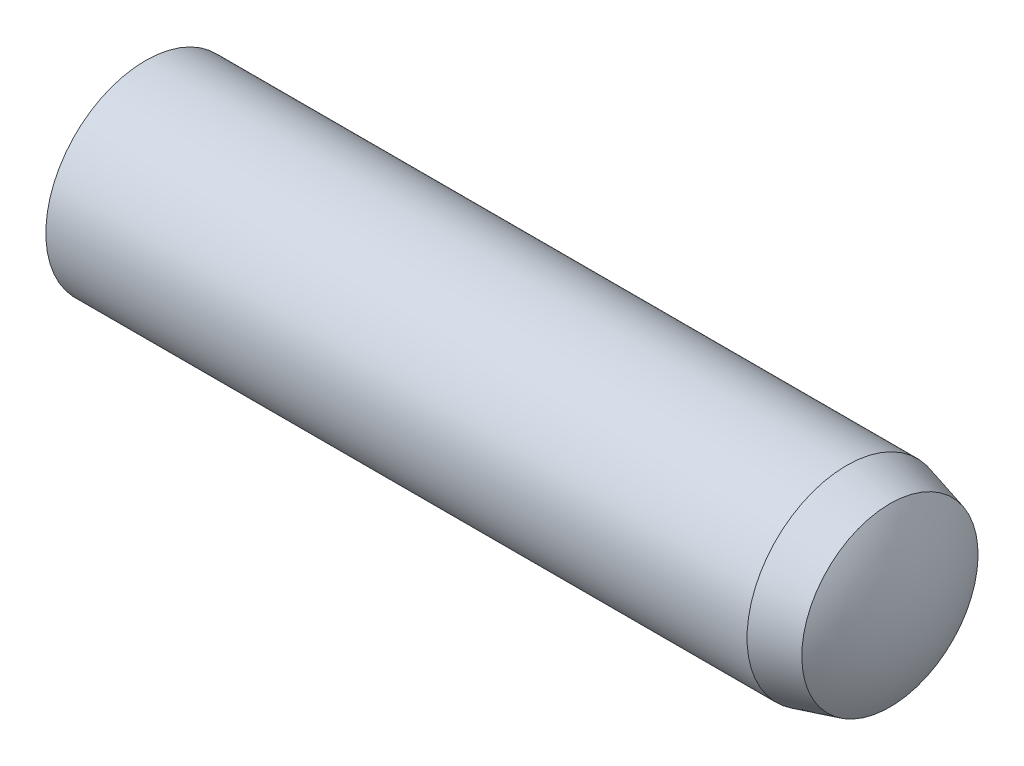
ISO-10303-21;
HEADER;
FILE_DESCRIPTION(('STEP AP214'),'2;1');
FILE_NAME('part.step','',(''),(''),'','','');
FILE_SCHEMA(('AUTOMOTIVE_DESIGN { 1 0 10303 214 1 1 1 1 }'));
ENDSEC;
DATA;
#1=APPLICATION_CONTEXT('core data for automotive mechanical design processes');
#2=APPLICATION_PROTOCOL_DEFINITION('international standard','automotive_design',2000,#1);
#3=PRODUCT_CONTEXT('',#1,'mechanical');
#4=PRODUCT('Part','Part','',(#3));
#5=PRODUCT_RELATED_PRODUCT_CATEGORY('part','',(#4));
#6=PRODUCT_DEFINITION_FORMATION('','',#4);
#7=PRODUCT_DEFINITION_CONTEXT('part definition',#1,'design');
#8=PRODUCT_DEFINITION('design','',#6,#7);
#9=PRODUCT_DEFINITION_SHAPE('','',#8);
#10=(LENGTH_UNIT() NAMED_UNIT(*) SI_UNIT(.MILLI.,.METRE.));
#11=(NAMED_UNIT(*) PLANE_ANGLE_UNIT() SI_UNIT($,.RADIAN.));
#12=(NAMED_UNIT(*) SI_UNIT($,.STERADIAN.) SOLID_ANGLE_UNIT());
#13=UNCERTAINTY_MEASURE_WITH_UNIT(LENGTH_MEASURE(1.E-05),#10,'distance_accuracy_value','');
#14=(GEOMETRIC_REPRESENTATION_CONTEXT(3) GLOBAL_UNCERTAINTY_ASSIGNED_CONTEXT((#13)) GLOBAL_UNIT_ASSIGNED_CONTEXT((#10,
#11,#12)) REPRESENTATION_CONTEXT('',''));
#15=CARTESIAN_POINT('',(0.,0.,0.));
#16=DIRECTION('',(0.,0.,1.));
#17=DIRECTION('',(1.,0.,0.));
#18=AXIS2_PLACEMENT_3D('',#15,#16,#17);
#19=CARTESIAN_POINT('',(19.2054169750802,0.,0.));
#20=DIRECTION('',(1.,0.,0.));
#21=DIRECTION('',(0.,1.,0.));
#22=AXIS2_PLACEMENT_3D('',#19,#20,#21);
#23=SPHERICAL_SURFACE('',#22,4.79458302491977);
#24=CARTESIAN_POINT('',(24.,0.,0.));
#25=VERTEX_POINT('',#24);
#26=VERTEX_LOOP('',#25);
#27=FACE_BOUND('',#26,.T.);
#28=CARTESIAN_POINT('',(23.2000000000312,0.,0.));
#29=DIRECTION('',(-1.,0.,0.));
#30=DIRECTION('',(0.,1.,0.));
#31=AXIS2_PLACEMENT_3D('',#28,#29,#30);
#32=CIRCLE('',#31,2.65166605004196);
#33=CARTESIAN_POINT('',(23.2000000000312,2.65166605004197,0.));
#34=VERTEX_POINT('',#33);
#35=EDGE_CURVE('E37',#34,#34,#32,.T.);
#36=ORIENTED_EDGE('',*,*,#35,.F.);
#37=EDGE_LOOP('',(#36));
#38=FACE_BOUND('',#37,.T.);
#39=ADVANCED_FACE('F17',(#27,#38),#23,.T.);
#40=CARTESIAN_POINT('',(21.8999999999028,0.,0.));
#41=DIRECTION('',(-1.,0.,0.));
#42=DIRECTION('',(0.,0.,1.));
#43=AXIS2_PLACEMENT_3D('',#40,#41,#42);
#44=CONICAL_SURFACE('',#43,2.99999999981537,0.261799387496663);
#45=CARTESIAN_POINT('',(21.9,0.,0.));
#46=DIRECTION('',(1.,0.,0.));
#47=DIRECTION('',(0.,1.,0.));
#48=AXIS2_PLACEMENT_3D('',#45,#46,#47);
#49=CIRCLE('',#48,3.);
#50=CARTESIAN_POINT('',(21.9,3.00000000000001,0.));
#51=VERTEX_POINT('',#50);
#52=EDGE_CURVE('E26',#51,#51,#49,.F.);
#53=ORIENTED_EDGE('',*,*,#52,.F.);
#54=EDGE_LOOP('',(#53));
#55=FACE_BOUND('',#54,.T.);
#56=ORIENTED_EDGE('',*,*,#35,.T.);
#57=EDGE_LOOP('',(#56));
#58=FACE_BOUND('',#57,.T.);
#59=ADVANCED_FACE('F34',(#55,#58),#44,.T.);
#60=CARTESIAN_POINT('',(6.025,0.,0.));
#61=DIRECTION('',(1.,0.,0.));
#62=DIRECTION('',(0.,1.,0.));
#63=AXIS2_PLACEMENT_3D('',#60,#61,#62);
#64=SPHERICAL_SURFACE('',#63,6.025);
#65=CARTESIAN_POINT('',(0.,0.,0.));
#66=VERTEX_POINT('',#65);
#67=VERTEX_LOOP('',#66);
#68=FACE_BOUND('',#67,.T.);
#69=CARTESIAN_POINT('',(0.8,0.,0.));
#70=DIRECTION('',(1.,0.,0.));
#71=DIRECTION('',(0.,1.,0.));
#72=AXIS2_PLACEMENT_3D('',#69,#70,#71);
#73=CIRCLE('',#72,3.);
#74=CARTESIAN_POINT('',(0.8,3.,0.));
#75=VERTEX_POINT('',#74);
#76=EDGE_CURVE('E11',#75,#75,#73,.T.);
#77=ORIENTED_EDGE('',*,*,#76,.F.);
#78=EDGE_LOOP('',(#77));
#79=FACE_BOUND('',#78,.T.);
#80=ADVANCED_FACE('F48',(#68,#79),#64,.T.);
#81=CARTESIAN_POINT('',(11.35,0.,0.));
#82=DIRECTION('',(1.,0.,0.));
#83=DIRECTION('',(0.,1.,0.));
#84=AXIS2_PLACEMENT_3D('',#81,#82,#83);
#85=CYLINDRICAL_SURFACE('',#84,3.);
#86=ORIENTED_EDGE('',*,*,#76,.T.);
#87=EDGE_LOOP('',(#86));
#88=FACE_BOUND('',#87,.T.);
#89=ORIENTED_EDGE('',*,*,#52,.T.);
#90=EDGE_LOOP('',(#89));
#91=FACE_BOUND('',#90,.T.);
#92=ADVANCED_FACE('F51',(#88,#91),#85,.T.);
#93=CLOSED_SHELL('',(#39,#59,#80,#92));
#94=MANIFOLD_SOLID_BREP('B1',#93);
#95=ADVANCED_BREP_SHAPE_REPRESENTATION('',(#18,#94),#14);
#96=SHAPE_DEFINITION_REPRESENTATION(#9,#95);
ENDSEC;
END-ISO-10303-21;
